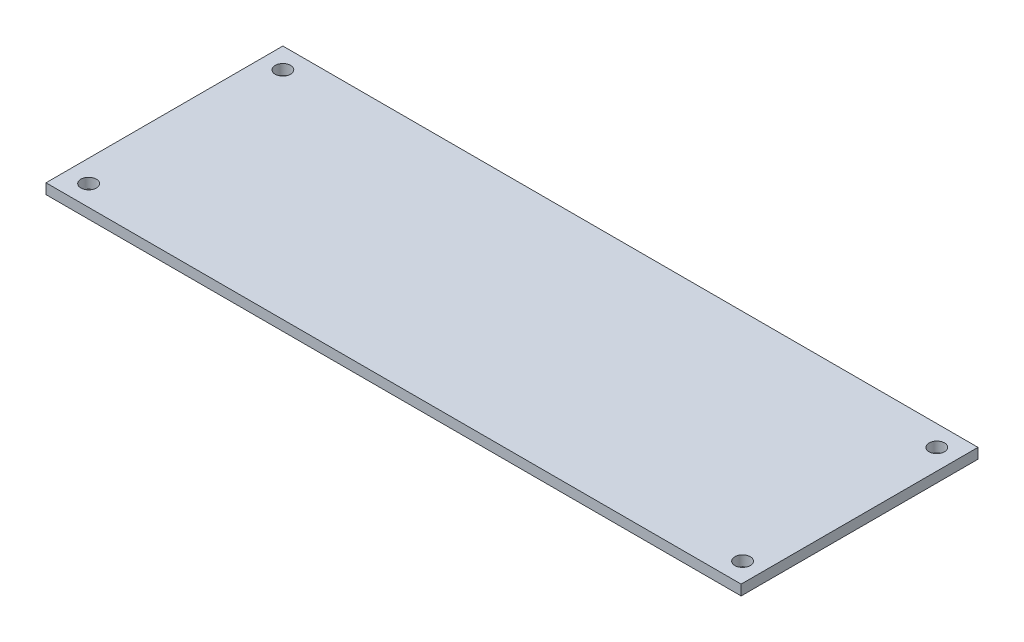
ISO-10303-21;
HEADER;
FILE_DESCRIPTION(('STEP AP214'),'2;1');
FILE_NAME('part.step','',(''),(''),'','','');
FILE_SCHEMA(('AUTOMOTIVE_DESIGN { 1 0 10303 214 1 1 1 1 }'));
ENDSEC;
DATA;
#1=APPLICATION_CONTEXT('core data for automotive mechanical design processes');
#2=APPLICATION_PROTOCOL_DEFINITION('international standard','automotive_design',2000,#1);
#3=PRODUCT_CONTEXT('',#1,'mechanical');
#4=PRODUCT('Part','Part','',(#3));
#5=PRODUCT_RELATED_PRODUCT_CATEGORY('part','',(#4));
#6=PRODUCT_DEFINITION_FORMATION('','',#4);
#7=PRODUCT_DEFINITION_CONTEXT('part definition',#1,'design');
#8=PRODUCT_DEFINITION('design','',#6,#7);
#9=PRODUCT_DEFINITION_SHAPE('','',#8);
#10=(LENGTH_UNIT() NAMED_UNIT(*) SI_UNIT(.MILLI.,.METRE.));
#11=(NAMED_UNIT(*) PLANE_ANGLE_UNIT() SI_UNIT($,.RADIAN.));
#12=(NAMED_UNIT(*) SI_UNIT($,.STERADIAN.) SOLID_ANGLE_UNIT());
#13=UNCERTAINTY_MEASURE_WITH_UNIT(LENGTH_MEASURE(1.E-05),#10,'distance_accuracy_value','');
#14=(GEOMETRIC_REPRESENTATION_CONTEXT(3) GLOBAL_UNCERTAINTY_ASSIGNED_CONTEXT((#13)) GLOBAL_UNIT_ASSIGNED_CONTEXT((#10,
#11,#12)) REPRESENTATION_CONTEXT('',''));
#15=CARTESIAN_POINT('',(0.,0.,0.));
#16=DIRECTION('',(0.,0.,1.));
#17=DIRECTION('',(1.,0.,0.));
#18=AXIS2_PLACEMENT_3D('',#15,#16,#17);
#19=CARTESIAN_POINT('',(0.,2.,0.));
#20=DIRECTION('',(0.,1.,0.));
#21=DIRECTION('',(0.,0.,1.));
#22=AXIS2_PLACEMENT_3D('',#19,#20,#21);
#23=PLANE('',#22);
#24=CARTESIAN_POINT('',(63.7775034243988,2.,19.));
#25=DIRECTION('',(0.,1.,0.));
#26=DIRECTION('',(0.,0.,1.));
#27=AXIS2_PLACEMENT_3D('',#24,#25,#26);
#28=CIRCLE('',#27,1.5);
#29=CARTESIAN_POINT('',(63.7775034243988,2.,20.5));
#30=VERTEX_POINT('',#29);
#31=EDGE_CURVE('E121',#30,#30,#28,.T.);
#32=ORIENTED_EDGE('',*,*,#31,.F.);
#33=EDGE_LOOP('',(#32));
#34=FACE_BOUND('',#33,.T.);
#35=CARTESIAN_POINT('',(-63.5,2.,-19.));
#36=DIRECTION('',(0.,1.,0.));
#37=DIRECTION('',(0.,0.,1.));
#38=AXIS2_PLACEMENT_3D('',#35,#36,#37);
#39=CIRCLE('',#38,1.5);
#40=CARTESIAN_POINT('',(-63.5,2.,-17.5));
#41=VERTEX_POINT('',#40);
#42=EDGE_CURVE('E100',#41,#41,#39,.T.);
#43=ORIENTED_EDGE('',*,*,#42,.F.);
#44=EDGE_LOOP('',(#43));
#45=FACE_BOUND('',#44,.T.);
#46=DIRECTION('',(0.,0.,1.));
#47=VECTOR('',#46,1.);
#48=CARTESIAN_POINT('',(-67.5,2.,23.));
#49=LINE('',#48,#47);
#50=CARTESIAN_POINT('',(-67.5,2.,-23.));
#51=VERTEX_POINT('',#50);
#52=CARTESIAN_POINT('',(-67.5,2.,23.));
#53=VERTEX_POINT('',#52);
#54=EDGE_CURVE('E85',#51,#53,#49,.T.);
#55=ORIENTED_EDGE('',*,*,#54,.T.);
#56=DIRECTION('',(1.,0.,0.));
#57=VECTOR('',#56,1.);
#58=CARTESIAN_POINT('',(67.5,2.,23.));
#59=LINE('',#58,#57);
#60=CARTESIAN_POINT('',(67.5,2.,23.));
#61=VERTEX_POINT('',#60);
#62=EDGE_CURVE('E80',#53,#61,#59,.T.);
#63=ORIENTED_EDGE('',*,*,#62,.T.);
#64=DIRECTION('',(0.,0.,-1.));
#65=VECTOR('',#64,1.);
#66=CARTESIAN_POINT('',(67.5,2.,23.));
#67=LINE('',#66,#65);
#68=CARTESIAN_POINT('',(67.5,2.,-23.));
#69=VERTEX_POINT('',#68);
#70=EDGE_CURVE('E83',#61,#69,#67,.T.);
#71=ORIENTED_EDGE('',*,*,#70,.T.);
#72=DIRECTION('',(-1.,0.,0.));
#73=VECTOR('',#72,1.);
#74=CARTESIAN_POINT('',(67.5,2.,-23.));
#75=LINE('',#74,#73);
#76=EDGE_CURVE('E50',#69,#51,#75,.T.);
#77=ORIENTED_EDGE('',*,*,#76,.T.);
#78=EDGE_LOOP('',(#55,#63,#71,#77));
#79=FACE_BOUND('',#78,.T.);
#80=CARTESIAN_POINT('',(63.5,2.,-19.));
#81=DIRECTION('',(0.,1.,0.));
#82=DIRECTION('',(0.,0.,1.));
#83=AXIS2_PLACEMENT_3D('',#80,#81,#82);
#84=CIRCLE('',#83,1.5);
#85=CARTESIAN_POINT('',(63.5,2.,-17.5));
#86=VERTEX_POINT('',#85);
#87=EDGE_CURVE('E115',#86,#86,#84,.T.);
#88=ORIENTED_EDGE('',*,*,#87,.F.);
#89=EDGE_LOOP('',(#88));
#90=FACE_BOUND('',#89,.T.);
#91=CARTESIAN_POINT('',(-63.2224965756012,2.,18.9989867213515));
#92=DIRECTION('',(0.,1.,0.));
#93=DIRECTION('',(0.,0.,1.));
#94=AXIS2_PLACEMENT_3D('',#91,#92,#93);
#95=CIRCLE('',#94,1.5);
#96=CARTESIAN_POINT('',(-63.2224965756012,2.,20.4989867213515));
#97=VERTEX_POINT('',#96);
#98=EDGE_CURVE('E127',#97,#97,#95,.T.);
#99=ORIENTED_EDGE('',*,*,#98,.F.);
#100=EDGE_LOOP('',(#99));
#101=FACE_BOUND('',#100,.T.);
#102=ADVANCED_FACE('F33',(#34,#45,#79,#90,#101),#23,.T.);
#103=CARTESIAN_POINT('',(0.,0.,0.));
#104=DIRECTION('',(0.,1.,0.));
#105=DIRECTION('',(0.,0.,1.));
#106=AXIS2_PLACEMENT_3D('',#103,#104,#105);
#107=PLANE('',#106);
#108=DIRECTION('',(0.,0.,1.));
#109=VECTOR('',#108,1.);
#110=CARTESIAN_POINT('',(-67.5,0.,23.));
#111=LINE('',#110,#109);
#112=CARTESIAN_POINT('',(-67.5,0.,-23.));
#113=VERTEX_POINT('',#112);
#114=CARTESIAN_POINT('',(-67.5,0.,23.));
#115=VERTEX_POINT('',#114);
#116=EDGE_CURVE('E97',#113,#115,#111,.T.);
#117=ORIENTED_EDGE('',*,*,#116,.F.);
#118=DIRECTION('',(-1.,0.,0.));
#119=VECTOR('',#118,1.);
#120=CARTESIAN_POINT('',(67.5,0.,-23.));
#121=LINE('',#120,#119);
#122=CARTESIAN_POINT('',(67.5,0.,-23.));
#123=VERTEX_POINT('',#122);
#124=EDGE_CURVE('E73',#123,#113,#121,.T.);
#125=ORIENTED_EDGE('',*,*,#124,.F.);
#126=DIRECTION('',(0.,0.,-1.));
#127=VECTOR('',#126,1.);
#128=CARTESIAN_POINT('',(67.5,0.,23.));
#129=LINE('',#128,#127);
#130=CARTESIAN_POINT('',(67.5,0.,23.));
#131=VERTEX_POINT('',#130);
#132=EDGE_CURVE('E67',#131,#123,#129,.T.);
#133=ORIENTED_EDGE('',*,*,#132,.F.);
#134=DIRECTION('',(1.,0.,0.));
#135=VECTOR('',#134,1.);
#136=CARTESIAN_POINT('',(67.5,0.,23.));
#137=LINE('',#136,#135);
#138=EDGE_CURVE('E89',#115,#131,#137,.T.);
#139=ORIENTED_EDGE('',*,*,#138,.F.);
#140=EDGE_LOOP('',(#117,#125,#133,#139));
#141=FACE_BOUND('',#140,.T.);
#142=CARTESIAN_POINT('',(-63.5,0.,-19.));
#143=DIRECTION('',(0.,1.,0.));
#144=DIRECTION('',(0.,0.,1.));
#145=AXIS2_PLACEMENT_3D('',#142,#143,#144);
#146=CIRCLE('',#145,1.5);
#147=CARTESIAN_POINT('',(-63.5,0.,-17.5));
#148=VERTEX_POINT('',#147);
#149=EDGE_CURVE('E112',#148,#148,#146,.T.);
#150=ORIENTED_EDGE('',*,*,#149,.T.);
#151=EDGE_LOOP('',(#150));
#152=FACE_BOUND('',#151,.T.);
#153=CARTESIAN_POINT('',(63.5,0.,-19.));
#154=DIRECTION('',(0.,1.,0.));
#155=DIRECTION('',(0.,0.,1.));
#156=AXIS2_PLACEMENT_3D('',#153,#154,#155);
#157=CIRCLE('',#156,1.5);
#158=CARTESIAN_POINT('',(63.5,0.,-17.5));
#159=VERTEX_POINT('',#158);
#160=EDGE_CURVE('E118',#159,#159,#157,.T.);
#161=ORIENTED_EDGE('',*,*,#160,.T.);
#162=EDGE_LOOP('',(#161));
#163=FACE_BOUND('',#162,.T.);
#164=CARTESIAN_POINT('',(63.7775034243988,0.,19.));
#165=DIRECTION('',(0.,1.,0.));
#166=DIRECTION('',(0.,0.,1.));
#167=AXIS2_PLACEMENT_3D('',#164,#165,#166);
#168=CIRCLE('',#167,1.5);
#169=CARTESIAN_POINT('',(63.7775034243988,0.,20.5));
#170=VERTEX_POINT('',#169);
#171=EDGE_CURVE('E124',#170,#170,#168,.T.);
#172=ORIENTED_EDGE('',*,*,#171,.T.);
#173=EDGE_LOOP('',(#172));
#174=FACE_BOUND('',#173,.T.);
#175=CARTESIAN_POINT('',(-63.2224965756012,0.,18.9989867213515));
#176=DIRECTION('',(0.,1.,0.));
#177=DIRECTION('',(0.,0.,1.));
#178=AXIS2_PLACEMENT_3D('',#175,#176,#177);
#179=CIRCLE('',#178,1.5);
#180=CARTESIAN_POINT('',(-63.2224965756012,0.,20.4989867213515));
#181=VERTEX_POINT('',#180);
#182=EDGE_CURVE('E130',#181,#181,#179,.T.);
#183=ORIENTED_EDGE('',*,*,#182,.T.);
#184=EDGE_LOOP('',(#183));
#185=FACE_BOUND('',#184,.T.);
#186=ADVANCED_FACE('F108',(#141,#152,#163,#174,#185),#107,.F.);
#187=CARTESIAN_POINT('',(-67.5,2.,23.));
#188=DIRECTION('',(1.,0.,0.));
#189=DIRECTION('',(0.,0.,-1.));
#190=AXIS2_PLACEMENT_3D('',#187,#188,#189);
#191=PLANE('',#190);
#192=ORIENTED_EDGE('',*,*,#116,.T.);
#193=DIRECTION('',(0.,-1.,0.));
#194=VECTOR('',#193,1.);
#195=CARTESIAN_POINT('',(-67.5,2.,23.));
#196=LINE('',#195,#194);
#197=EDGE_CURVE('E11',#53,#115,#196,.T.);
#198=ORIENTED_EDGE('',*,*,#197,.F.);
#199=ORIENTED_EDGE('',*,*,#54,.F.);
#200=DIRECTION('',(0.,-1.,0.));
#201=VECTOR('',#200,1.);
#202=CARTESIAN_POINT('',(-67.5,2.,-23.));
#203=LINE('',#202,#201);
#204=EDGE_CURVE('E93',#51,#113,#203,.T.);
#205=ORIENTED_EDGE('',*,*,#204,.T.);
#206=EDGE_LOOP('',(#192,#198,#199,#205));
#207=FACE_BOUND('',#206,.T.);
#208=ADVANCED_FACE('F35',(#207),#191,.F.);
#209=CARTESIAN_POINT('',(67.5,2.,23.));
#210=DIRECTION('',(0.,0.,-1.));
#211=DIRECTION('',(-1.,0.,0.));
#212=AXIS2_PLACEMENT_3D('',#209,#210,#211);
#213=PLANE('',#212);
#214=ORIENTED_EDGE('',*,*,#138,.T.);
#215=DIRECTION('',(0.,-1.,0.));
#216=VECTOR('',#215,1.);
#217=CARTESIAN_POINT('',(67.5,2.,23.));
#218=LINE('',#217,#216);
#219=EDGE_CURVE('E42',#61,#131,#218,.T.);
#220=ORIENTED_EDGE('',*,*,#219,.F.);
#221=ORIENTED_EDGE('',*,*,#62,.F.);
#222=ORIENTED_EDGE('',*,*,#197,.T.);
#223=EDGE_LOOP('',(#214,#220,#221,#222));
#224=FACE_BOUND('',#223,.T.);
#225=ADVANCED_FACE('F88',(#224),#213,.F.);
#226=CARTESIAN_POINT('',(67.5,2.,23.));
#227=DIRECTION('',(-1.,0.,0.));
#228=DIRECTION('',(0.,0.,1.));
#229=AXIS2_PLACEMENT_3D('',#226,#227,#228);
#230=PLANE('',#229);
#231=ORIENTED_EDGE('',*,*,#132,.T.);
#232=DIRECTION('',(0.,-1.,0.));
#233=VECTOR('',#232,1.);
#234=CARTESIAN_POINT('',(67.5,2.,-23.));
#235=LINE('',#234,#233);
#236=EDGE_CURVE('E90',#69,#123,#235,.T.);
#237=ORIENTED_EDGE('',*,*,#236,.F.);
#238=ORIENTED_EDGE('',*,*,#70,.F.);
#239=ORIENTED_EDGE('',*,*,#219,.T.);
#240=EDGE_LOOP('',(#231,#237,#238,#239));
#241=FACE_BOUND('',#240,.T.);
#242=ADVANCED_FACE('F91',(#241),#230,.F.);
#243=CARTESIAN_POINT('',(67.5,2.,-23.));
#244=DIRECTION('',(0.,0.,1.));
#245=DIRECTION('',(1.,0.,0.));
#246=AXIS2_PLACEMENT_3D('',#243,#244,#245);
#247=PLANE('',#246);
#248=ORIENTED_EDGE('',*,*,#124,.T.);
#249=ORIENTED_EDGE('',*,*,#204,.F.);
#250=ORIENTED_EDGE('',*,*,#76,.F.);
#251=ORIENTED_EDGE('',*,*,#236,.T.);
#252=EDGE_LOOP('',(#248,#249,#250,#251));
#253=FACE_BOUND('',#252,.T.);
#254=ADVANCED_FACE('F105',(#253),#247,.F.);
#255=CARTESIAN_POINT('',(-63.5,2.,-19.));
#256=DIRECTION('',(0.,-1.,0.));
#257=DIRECTION('',(0.,0.,-1.));
#258=AXIS2_PLACEMENT_3D('',#255,#256,#257);
#259=CYLINDRICAL_SURFACE('',#258,1.5);
#260=ORIENTED_EDGE('',*,*,#42,.T.);
#261=EDGE_LOOP('',(#260));
#262=FACE_BOUND('',#261,.T.);
#263=ORIENTED_EDGE('',*,*,#149,.F.);
#264=EDGE_LOOP('',(#263));
#265=FACE_BOUND('',#264,.T.);
#266=ADVANCED_FACE('F149',(#262,#265),#259,.F.);
#267=CARTESIAN_POINT('',(63.5,2.,-19.));
#268=DIRECTION('',(0.,-1.,0.));
#269=DIRECTION('',(0.,0.,-1.));
#270=AXIS2_PLACEMENT_3D('',#267,#268,#269);
#271=CYLINDRICAL_SURFACE('',#270,1.5);
#272=ORIENTED_EDGE('',*,*,#87,.T.);
#273=EDGE_LOOP('',(#272));
#274=FACE_BOUND('',#273,.T.);
#275=ORIENTED_EDGE('',*,*,#160,.F.);
#276=EDGE_LOOP('',(#275));
#277=FACE_BOUND('',#276,.T.);
#278=ADVANCED_FACE('F195',(#274,#277),#271,.F.);
#279=CARTESIAN_POINT('',(63.7775034243988,2.,19.));
#280=DIRECTION('',(0.,-1.,0.));
#281=DIRECTION('',(0.,0.,-1.));
#282=AXIS2_PLACEMENT_3D('',#279,#280,#281);
#283=CYLINDRICAL_SURFACE('',#282,1.5);
#284=ORIENTED_EDGE('',*,*,#31,.T.);
#285=EDGE_LOOP('',(#284));
#286=FACE_BOUND('',#285,.T.);
#287=ORIENTED_EDGE('',*,*,#171,.F.);
#288=EDGE_LOOP('',(#287));
#289=FACE_BOUND('',#288,.T.);
#290=ADVANCED_FACE('F203',(#286,#289),#283,.F.);
#291=CARTESIAN_POINT('',(-63.2224965756012,2.,18.9989867213515));
#292=DIRECTION('',(0.,-1.,0.));
#293=DIRECTION('',(0.,0.,-1.));
#294=AXIS2_PLACEMENT_3D('',#291,#292,#293);
#295=CYLINDRICAL_SURFACE('',#294,1.5);
#296=ORIENTED_EDGE('',*,*,#98,.T.);
#297=EDGE_LOOP('',(#296));
#298=FACE_BOUND('',#297,.T.);
#299=ORIENTED_EDGE('',*,*,#182,.F.);
#300=EDGE_LOOP('',(#299));
#301=FACE_BOUND('',#300,.T.);
#302=ADVANCED_FACE('F136',(#298,#301),#295,.F.);
#303=CLOSED_SHELL('',(#102,#186,#208,#225,#242,#254,#266,#278,#290,#302));
#304=MANIFOLD_SOLID_BREP('B2',#303);
#305=ADVANCED_BREP_SHAPE_REPRESENTATION('',(#18,#304),#14);
#306=SHAPE_DEFINITION_REPRESENTATION(#9,#305);
ENDSEC;
END-ISO-10303-21;
